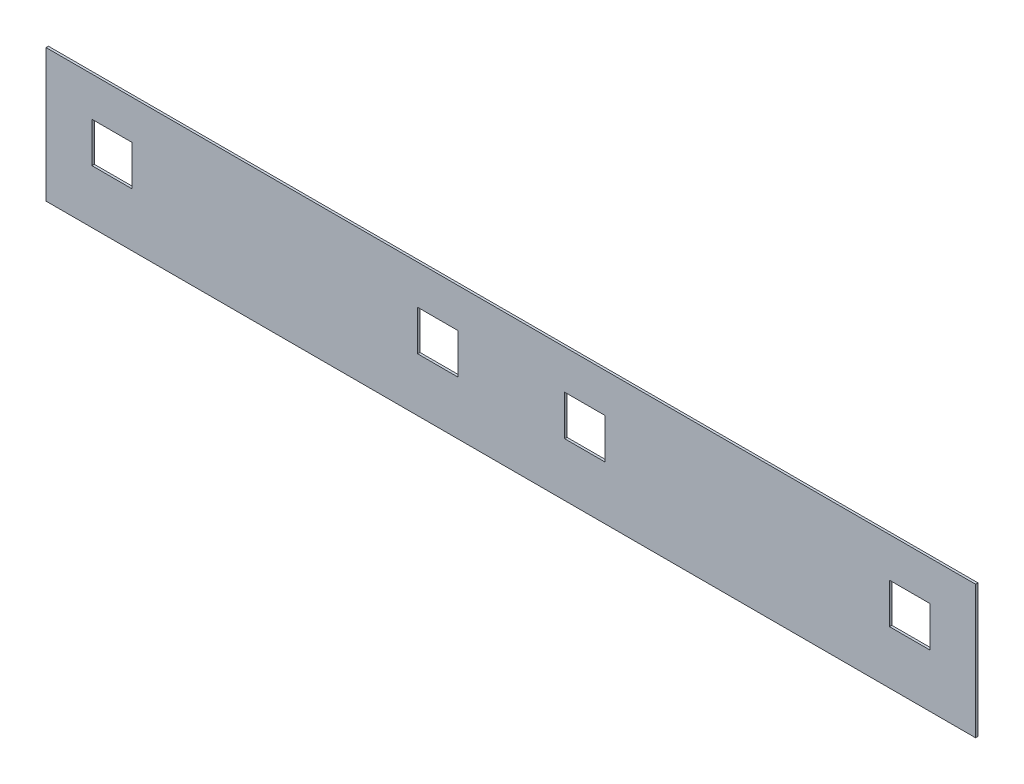
ISO-10303-21;
HEADER;
FILE_DESCRIPTION(('STEP AP214'),'2;1');
FILE_NAME('part.step','',(''),(''),'','','');
FILE_SCHEMA(('AUTOMOTIVE_DESIGN { 1 0 10303 214 1 1 1 1 }'));
ENDSEC;
DATA;
#1=APPLICATION_CONTEXT('core data for automotive mechanical design processes');
#2=APPLICATION_PROTOCOL_DEFINITION('international standard','automotive_design',2000,#1);
#3=PRODUCT_CONTEXT('',#1,'mechanical');
#4=PRODUCT('Part','Part','',(#3));
#5=PRODUCT_RELATED_PRODUCT_CATEGORY('part','',(#4));
#6=PRODUCT_DEFINITION_FORMATION('','',#4);
#7=PRODUCT_DEFINITION_CONTEXT('part definition',#1,'design');
#8=PRODUCT_DEFINITION('design','',#6,#7);
#9=PRODUCT_DEFINITION_SHAPE('','',#8);
#10=(LENGTH_UNIT() NAMED_UNIT(*) SI_UNIT(.MILLI.,.METRE.));
#11=(NAMED_UNIT(*) PLANE_ANGLE_UNIT() SI_UNIT($,.RADIAN.));
#12=(NAMED_UNIT(*) SI_UNIT($,.STERADIAN.) SOLID_ANGLE_UNIT());
#13=UNCERTAINTY_MEASURE_WITH_UNIT(LENGTH_MEASURE(1.E-05),#10,'distance_accuracy_value','');
#14=(GEOMETRIC_REPRESENTATION_CONTEXT(3) GLOBAL_UNCERTAINTY_ASSIGNED_CONTEXT((#13)) GLOBAL_UNIT_ASSIGNED_CONTEXT((#10,
#11,#12)) REPRESENTATION_CONTEXT('',''));
#15=CARTESIAN_POINT('',(0.,0.,0.));
#16=DIRECTION('',(0.,0.,1.));
#17=DIRECTION('',(1.,0.,0.));
#18=AXIS2_PLACEMENT_3D('',#15,#16,#17);
#19=CARTESIAN_POINT('',(0.,0.,-1.5875));
#20=DIRECTION('',(0.,0.,-1.));
#21=DIRECTION('',(-1.,0.,0.));
#22=AXIS2_PLACEMENT_3D('',#19,#20,#21);
#23=PLANE('',#22);
#24=DIRECTION('',(0.,-1.,0.));
#25=VECTOR('',#24,1.);
#26=CARTESIAN_POINT('',(253.08076638,0.,-1.5875));
#27=LINE('',#26,#25);
#28=CARTESIAN_POINT('',(253.08076638,18.0086,-1.5875));
#29=VERTEX_POINT('',#28);
#30=CARTESIAN_POINT('',(253.08076638,-8.88999999999995,-1.5875));
#31=VERTEX_POINT('',#30);
#32=EDGE_CURVE('E247',#29,#31,#27,.T.);
#33=ORIENTED_EDGE('',*,*,#32,.T.);
#34=DIRECTION('',(1.,0.,0.));
#35=VECTOR('',#34,1.);
#36=CARTESIAN_POINT('',(0.,-8.88999999999995,-1.5875));
#37=LINE('',#36,#35);
#38=CARTESIAN_POINT('',(280.25876638,-8.88999999999995,-1.5875));
#39=VERTEX_POINT('',#38);
#40=EDGE_CURVE('E250',#31,#39,#37,.T.);
#41=ORIENTED_EDGE('',*,*,#40,.T.);
#42=DIRECTION('',(0.,1.,0.));
#43=VECTOR('',#42,1.);
#44=CARTESIAN_POINT('',(280.25876638,0.,-1.5875));
#45=LINE('',#44,#43);
#46=CARTESIAN_POINT('',(280.25876638,18.0086000000001,-1.5875));
#47=VERTEX_POINT('',#46);
#48=EDGE_CURVE('E53',#39,#47,#45,.T.);
#49=ORIENTED_EDGE('',*,*,#48,.T.);
#50=DIRECTION('',(-1.,0.,0.));
#51=VECTOR('',#50,1.);
#52=CARTESIAN_POINT('',(0.,18.0086,-1.5875));
#53=LINE('',#52,#51);
#54=EDGE_CURVE('E255',#47,#29,#53,.T.);
#55=ORIENTED_EDGE('',*,*,#54,.T.);
#56=EDGE_LOOP('',(#33,#41,#49,#55));
#57=FACE_BOUND('',#56,.T.);
#58=DIRECTION('',(0.,-1.,0.));
#59=VECTOR('',#58,1.);
#60=CARTESIAN_POINT('',(-279.94780561,0.,-1.5875));
#61=LINE('',#60,#59);
#62=CARTESIAN_POINT('',(-279.94780561,18.288,-1.5875));
#63=VERTEX_POINT('',#62);
#64=CARTESIAN_POINT('',(-279.94780561,-8.5725,-1.5875));
#65=VERTEX_POINT('',#64);
#66=EDGE_CURVE('E219',#63,#65,#61,.T.);
#67=ORIENTED_EDGE('',*,*,#66,.T.);
#68=DIRECTION('',(1.,0.,0.));
#69=VECTOR('',#68,1.);
#70=CARTESIAN_POINT('',(0.,-8.5725,-1.5875));
#71=LINE('',#70,#69);
#72=CARTESIAN_POINT('',(-253.02380561,-8.5725,-1.5875));
#73=VERTEX_POINT('',#72);
#74=EDGE_CURVE('E222',#65,#73,#71,.T.);
#75=ORIENTED_EDGE('',*,*,#74,.T.);
#76=DIRECTION('',(0.,-1.,0.));
#77=VECTOR('',#76,1.);
#78=CARTESIAN_POINT('',(-253.02380561,0.,-1.5875));
#79=LINE('',#78,#77);
#80=CARTESIAN_POINT('',(-253.02380561,18.288,-1.5875));
#81=VERTEX_POINT('',#80);
#82=EDGE_CURVE('E226',#81,#73,#79,.T.);
#83=ORIENTED_EDGE('',*,*,#82,.F.);
#84=DIRECTION('',(1.,0.,0.));
#85=VECTOR('',#84,1.);
#86=CARTESIAN_POINT('',(0.,18.288,-1.5875));
#87=LINE('',#86,#85);
#88=EDGE_CURVE('E228',#63,#81,#87,.T.);
#89=ORIENTED_EDGE('',*,*,#88,.F.);
#90=EDGE_LOOP('',(#67,#75,#83,#89));
#91=FACE_BOUND('',#90,.T.);
#92=DIRECTION('',(1.,0.,0.));
#93=VECTOR('',#92,1.);
#94=CARTESIAN_POINT('',(0.,-8.636,-1.5875));
#95=LINE('',#94,#93);
#96=CARTESIAN_POINT('',(-62.2554000000002,-8.636,-1.5875));
#97=VERTEX_POINT('',#96);
#98=CARTESIAN_POINT('',(-35.3314000000002,-8.636,-1.5875));
#99=VERTEX_POINT('',#98);
#100=EDGE_CURVE('E179',#97,#99,#95,.T.);
#101=ORIENTED_EDGE('',*,*,#100,.T.);
#102=DIRECTION('',(0.,1.,0.));
#103=VECTOR('',#102,1.);
#104=CARTESIAN_POINT('',(-35.3314000000002,0.,-1.5875));
#105=LINE('',#104,#103);
#106=CARTESIAN_POINT('',(-35.3314000000002,18.288,-1.5875));
#107=VERTEX_POINT('',#106);
#108=EDGE_CURVE('E190',#99,#107,#105,.T.);
#109=ORIENTED_EDGE('',*,*,#108,.T.);
#110=DIRECTION('',(1.,0.,0.));
#111=VECTOR('',#110,1.);
#112=CARTESIAN_POINT('',(0.,18.288,-1.5875));
#113=LINE('',#112,#111);
#114=CARTESIAN_POINT('',(-62.2554000000002,18.288,-1.5875));
#115=VERTEX_POINT('',#114);
#116=EDGE_CURVE('E195',#115,#107,#113,.T.);
#117=ORIENTED_EDGE('',*,*,#116,.F.);
#118=DIRECTION('',(0.,-1.,0.));
#119=VECTOR('',#118,1.);
#120=CARTESIAN_POINT('',(-62.2554000000002,0.,-1.5875));
#121=LINE('',#120,#119);
#122=EDGE_CURVE('E187',#115,#97,#121,.T.);
#123=ORIENTED_EDGE('',*,*,#122,.T.);
#124=EDGE_LOOP('',(#101,#109,#117,#123));
#125=FACE_BOUND('',#124,.T.);
#126=DIRECTION('',(0.,1.,0.));
#127=VECTOR('',#126,1.);
#128=CARTESIAN_POINT('',(310.642,-44.45,-1.5875));
#129=LINE('',#128,#127);
#130=CARTESIAN_POINT('',(310.642,-44.45,-1.5875));
#131=VERTEX_POINT('',#130);
#132=CARTESIAN_POINT('',(310.642,44.45,-1.5875));
#133=VERTEX_POINT('',#132);
#134=EDGE_CURVE('E308',#131,#133,#129,.T.);
#135=ORIENTED_EDGE('',*,*,#134,.F.);
#136=DIRECTION('',(1.,0.,0.));
#137=VECTOR('',#136,1.);
#138=CARTESIAN_POINT('',(-310.642,-44.45,-1.5875));
#139=LINE('',#138,#137);
#140=CARTESIAN_POINT('',(-310.642,-44.45,-1.5875));
#141=VERTEX_POINT('',#140);
#142=EDGE_CURVE('E318',#141,#131,#139,.T.);
#143=ORIENTED_EDGE('',*,*,#142,.F.);
#144=DIRECTION('',(0.,-1.,0.));
#145=VECTOR('',#144,1.);
#146=CARTESIAN_POINT('',(-310.642,-44.45,-1.5875));
#147=LINE('',#146,#145);
#148=CARTESIAN_POINT('',(-310.642,44.45,-1.5875));
#149=VERTEX_POINT('',#148);
#150=EDGE_CURVE('E315',#149,#141,#147,.T.);
#151=ORIENTED_EDGE('',*,*,#150,.F.);
#152=DIRECTION('',(-1.,0.,0.));
#153=VECTOR('',#152,1.);
#154=CARTESIAN_POINT('',(-310.642,44.45,-1.5875));
#155=LINE('',#154,#153);
#156=EDGE_CURVE('E311',#133,#149,#155,.T.);
#157=ORIENTED_EDGE('',*,*,#156,.F.);
#158=EDGE_LOOP('',(#135,#143,#151,#157));
#159=FACE_BOUND('',#158,.T.);
#160=DIRECTION('',(1.,0.,0.));
#161=VECTOR('',#160,1.);
#162=CARTESIAN_POINT('',(0.,-8.636,-1.5875));
#163=LINE('',#162,#161);
#164=CARTESIAN_POINT('',(36.0425999999998,-8.636,-1.5875));
#165=VERTEX_POINT('',#164);
#166=CARTESIAN_POINT('',(62.9665999999998,-8.636,-1.5875));
#167=VERTEX_POINT('',#166);
#168=EDGE_CURVE('E285',#165,#167,#163,.T.);
#169=ORIENTED_EDGE('',*,*,#168,.T.);
#170=DIRECTION('',(0.,-1.,0.));
#171=VECTOR('',#170,1.);
#172=CARTESIAN_POINT('',(62.9665999999998,0.,-1.5875));
#173=LINE('',#172,#171);
#174=CARTESIAN_POINT('',(62.9665999999998,18.288,-1.5875));
#175=VERTEX_POINT('',#174);
#176=EDGE_CURVE('E276',#175,#167,#173,.T.);
#177=ORIENTED_EDGE('',*,*,#176,.F.);
#178=DIRECTION('',(-1.,0.,0.));
#179=VECTOR('',#178,1.);
#180=CARTESIAN_POINT('',(0.,18.288,-1.5875));
#181=LINE('',#180,#179);
#182=CARTESIAN_POINT('',(36.0425999999998,18.288,-1.5875));
#183=VERTEX_POINT('',#182);
#184=EDGE_CURVE('E278',#175,#183,#181,.T.);
#185=ORIENTED_EDGE('',*,*,#184,.T.);
#186=DIRECTION('',(0.,-1.,0.));
#187=VECTOR('',#186,1.);
#188=CARTESIAN_POINT('',(36.0425999999998,0.,-1.5875));
#189=LINE('',#188,#187);
#190=EDGE_CURVE('E282',#183,#165,#189,.T.);
#191=ORIENTED_EDGE('',*,*,#190,.T.);
#192=EDGE_LOOP('',(#169,#177,#185,#191));
#193=FACE_BOUND('',#192,.T.);
#194=ADVANCED_FACE('F36',(#57,#91,#125,#159,#193),#23,.T.);
#195=CARTESIAN_POINT('',(0.,0.,0.));
#196=DIRECTION('',(0.,0.,-1.));
#197=DIRECTION('',(-1.,0.,0.));
#198=AXIS2_PLACEMENT_3D('',#195,#196,#197);
#199=PLANE('',#198);
#200=DIRECTION('',(1.,0.,0.));
#201=VECTOR('',#200,1.);
#202=CARTESIAN_POINT('',(0.,-8.88999999999995,0.));
#203=LINE('',#202,#201);
#204=CARTESIAN_POINT('',(253.08076638,-8.88999999999995,0.));
#205=VERTEX_POINT('',#204);
#206=CARTESIAN_POINT('',(280.25876638,-8.88999999999995,0.));
#207=VERTEX_POINT('',#206);
#208=EDGE_CURVE('E261',#205,#207,#203,.T.);
#209=ORIENTED_EDGE('',*,*,#208,.F.);
#210=DIRECTION('',(0.,-1.,0.));
#211=VECTOR('',#210,1.);
#212=CARTESIAN_POINT('',(253.08076638,0.,0.));
#213=LINE('',#212,#211);
#214=CARTESIAN_POINT('',(253.08076638,18.0086,0.));
#215=VERTEX_POINT('',#214);
#216=EDGE_CURVE('E259',#215,#205,#213,.T.);
#217=ORIENTED_EDGE('',*,*,#216,.F.);
#218=DIRECTION('',(-1.,0.,0.));
#219=VECTOR('',#218,1.);
#220=CARTESIAN_POINT('',(0.,18.0086,0.));
#221=LINE('',#220,#219);
#222=CARTESIAN_POINT('',(280.25876638,18.0086000000001,0.));
#223=VERTEX_POINT('',#222);
#224=EDGE_CURVE('E251',#223,#215,#221,.T.);
#225=ORIENTED_EDGE('',*,*,#224,.F.);
#226=DIRECTION('',(0.,1.,0.));
#227=VECTOR('',#226,1.);
#228=CARTESIAN_POINT('',(280.25876638,0.,0.));
#229=LINE('',#228,#227);
#230=EDGE_CURVE('E264',#207,#223,#229,.T.);
#231=ORIENTED_EDGE('',*,*,#230,.F.);
#232=EDGE_LOOP('',(#209,#217,#225,#231));
#233=FACE_BOUND('',#232,.T.);
#234=DIRECTION('',(1.,0.,0.));
#235=VECTOR('',#234,1.);
#236=CARTESIAN_POINT('',(0.,-8.5725,0.));
#237=LINE('',#236,#235);
#238=CARTESIAN_POINT('',(-279.94780561,-8.5725,0.));
#239=VERTEX_POINT('',#238);
#240=CARTESIAN_POINT('',(-253.02380561,-8.5725,0.));
#241=VERTEX_POINT('',#240);
#242=EDGE_CURVE('E233',#239,#241,#237,.T.);
#243=ORIENTED_EDGE('',*,*,#242,.F.);
#244=DIRECTION('',(0.,-1.,0.));
#245=VECTOR('',#244,1.);
#246=CARTESIAN_POINT('',(-279.94780561,0.,0.));
#247=LINE('',#246,#245);
#248=CARTESIAN_POINT('',(-279.94780561,18.288,0.));
#249=VERTEX_POINT('',#248);
#250=EDGE_CURVE('E231',#249,#239,#247,.T.);
#251=ORIENTED_EDGE('',*,*,#250,.F.);
#252=DIRECTION('',(1.,0.,0.));
#253=VECTOR('',#252,1.);
#254=CARTESIAN_POINT('',(0.,18.288,0.));
#255=LINE('',#254,#253);
#256=CARTESIAN_POINT('',(-253.02380561,18.288,0.));
#257=VERTEX_POINT('',#256);
#258=EDGE_CURVE('E223',#249,#257,#255,.T.);
#259=ORIENTED_EDGE('',*,*,#258,.T.);
#260=DIRECTION('',(0.,-1.,0.));
#261=VECTOR('',#260,1.);
#262=CARTESIAN_POINT('',(-253.02380561,0.,0.));
#263=LINE('',#262,#261);
#264=EDGE_CURVE('E236',#257,#241,#263,.T.);
#265=ORIENTED_EDGE('',*,*,#264,.T.);
#266=EDGE_LOOP('',(#243,#251,#259,#265));
#267=FACE_BOUND('',#266,.T.);
#268=DIRECTION('',(0.,1.,0.));
#269=VECTOR('',#268,1.);
#270=CARTESIAN_POINT('',(-35.3314000000002,0.,0.));
#271=LINE('',#270,#269);
#272=CARTESIAN_POINT('',(-35.3314000000002,-8.636,0.));
#273=VERTEX_POINT('',#272);
#274=CARTESIAN_POINT('',(-35.3314000000002,18.288,0.));
#275=VERTEX_POINT('',#274);
#276=EDGE_CURVE('E208',#273,#275,#271,.T.);
#277=ORIENTED_EDGE('',*,*,#276,.F.);
#278=DIRECTION('',(1.,0.,0.));
#279=VECTOR('',#278,1.);
#280=CARTESIAN_POINT('',(0.,-8.636,0.));
#281=LINE('',#280,#279);
#282=CARTESIAN_POINT('',(-62.2554000000002,-8.636,0.));
#283=VERTEX_POINT('',#282);
#284=EDGE_CURVE('E182',#283,#273,#281,.T.);
#285=ORIENTED_EDGE('',*,*,#284,.F.);
#286=DIRECTION('',(0.,-1.,0.));
#287=VECTOR('',#286,1.);
#288=CARTESIAN_POINT('',(-62.2554000000002,0.,0.));
#289=LINE('',#288,#287);
#290=CARTESIAN_POINT('',(-62.2554000000002,18.288,0.));
#291=VERTEX_POINT('',#290);
#292=EDGE_CURVE('E199',#291,#283,#289,.T.);
#293=ORIENTED_EDGE('',*,*,#292,.F.);
#294=DIRECTION('',(1.,0.,0.));
#295=VECTOR('',#294,1.);
#296=CARTESIAN_POINT('',(0.,18.288,0.));
#297=LINE('',#296,#295);
#298=EDGE_CURVE('E202',#291,#275,#297,.T.);
#299=ORIENTED_EDGE('',*,*,#298,.T.);
#300=EDGE_LOOP('',(#277,#285,#293,#299));
#301=FACE_BOUND('',#300,.T.);
#302=DIRECTION('',(0.,1.,0.));
#303=VECTOR('',#302,1.);
#304=CARTESIAN_POINT('',(310.642,-44.45,0.));
#305=LINE('',#304,#303);
#306=CARTESIAN_POINT('',(310.642,-44.45,0.));
#307=VERTEX_POINT('',#306);
#308=CARTESIAN_POINT('',(310.642,44.45,0.));
#309=VERTEX_POINT('',#308);
#310=EDGE_CURVE('E301',#307,#309,#305,.T.);
#311=ORIENTED_EDGE('',*,*,#310,.T.);
#312=DIRECTION('',(-1.,0.,0.));
#313=VECTOR('',#312,1.);
#314=CARTESIAN_POINT('',(-310.642,44.45,0.));
#315=LINE('',#314,#313);
#316=CARTESIAN_POINT('',(-310.642,44.45,0.));
#317=VERTEX_POINT('',#316);
#318=EDGE_CURVE('E323',#309,#317,#315,.T.);
#319=ORIENTED_EDGE('',*,*,#318,.T.);
#320=DIRECTION('',(0.,-1.,0.));
#321=VECTOR('',#320,1.);
#322=CARTESIAN_POINT('',(-310.642,-44.45,0.));
#323=LINE('',#322,#321);
#324=CARTESIAN_POINT('',(-310.642,-44.45,0.));
#325=VERTEX_POINT('',#324);
#326=EDGE_CURVE('E326',#317,#325,#323,.T.);
#327=ORIENTED_EDGE('',*,*,#326,.T.);
#328=DIRECTION('',(1.,0.,0.));
#329=VECTOR('',#328,1.);
#330=CARTESIAN_POINT('',(-310.642,-44.45,0.));
#331=LINE('',#330,#329);
#332=EDGE_CURVE('E312',#325,#307,#331,.T.);
#333=ORIENTED_EDGE('',*,*,#332,.T.);
#334=EDGE_LOOP('',(#311,#319,#327,#333));
#335=FACE_BOUND('',#334,.T.);
#336=DIRECTION('',(0.,-1.,0.));
#337=VECTOR('',#336,1.);
#338=CARTESIAN_POINT('',(62.9665999999998,0.,0.));
#339=LINE('',#338,#337);
#340=CARTESIAN_POINT('',(62.9665999999998,18.288,0.));
#341=VERTEX_POINT('',#340);
#342=CARTESIAN_POINT('',(62.9665999999998,-8.636,0.));
#343=VERTEX_POINT('',#342);
#344=EDGE_CURVE('E215',#341,#343,#339,.T.);
#345=ORIENTED_EDGE('',*,*,#344,.T.);
#346=DIRECTION('',(1.,0.,0.));
#347=VECTOR('',#346,1.);
#348=CARTESIAN_POINT('',(0.,-8.636,0.));
#349=LINE('',#348,#347);
#350=CARTESIAN_POINT('',(36.0425999999998,-8.636,0.));
#351=VERTEX_POINT('',#350);
#352=EDGE_CURVE('E279',#351,#343,#349,.T.);
#353=ORIENTED_EDGE('',*,*,#352,.F.);
#354=DIRECTION('',(0.,-1.,0.));
#355=VECTOR('',#354,1.);
#356=CARTESIAN_POINT('',(36.0425999999998,0.,0.));
#357=LINE('',#356,#355);
#358=CARTESIAN_POINT('',(36.0425999999998,18.288,0.));
#359=VERTEX_POINT('',#358);
#360=EDGE_CURVE('E294',#359,#351,#357,.T.);
#361=ORIENTED_EDGE('',*,*,#360,.F.);
#362=DIRECTION('',(-1.,0.,0.));
#363=VECTOR('',#362,1.);
#364=CARTESIAN_POINT('',(0.,18.288,0.));
#365=LINE('',#364,#363);
#366=EDGE_CURVE('E291',#341,#359,#365,.T.);
#367=ORIENTED_EDGE('',*,*,#366,.F.);
#368=EDGE_LOOP('',(#345,#353,#361,#367));
#369=FACE_BOUND('',#368,.T.);
#370=ADVANCED_FACE('F341',(#233,#267,#301,#335,#369),#199,.F.);
#371=CARTESIAN_POINT('',(310.642,-44.45,-1.5875));
#372=DIRECTION('',(1.,0.,0.));
#373=DIRECTION('',(0.,0.,-1.));
#374=AXIS2_PLACEMENT_3D('',#371,#372,#373);
#375=PLANE('',#374);
#376=ORIENTED_EDGE('',*,*,#310,.F.);
#377=DIRECTION('',(0.,0.,1.));
#378=VECTOR('',#377,1.);
#379=CARTESIAN_POINT('',(310.642,-44.45,-1.5875));
#380=LINE('',#379,#378);
#381=EDGE_CURVE('E11',#131,#307,#380,.T.);
#382=ORIENTED_EDGE('',*,*,#381,.F.);
#383=ORIENTED_EDGE('',*,*,#134,.T.);
#384=DIRECTION('',(0.,0.,1.));
#385=VECTOR('',#384,1.);
#386=CARTESIAN_POINT('',(310.642,44.45,-1.5875));
#387=LINE('',#386,#385);
#388=EDGE_CURVE('E40',#133,#309,#387,.T.);
#389=ORIENTED_EDGE('',*,*,#388,.T.);
#390=EDGE_LOOP('',(#376,#382,#383,#389));
#391=FACE_BOUND('',#390,.T.);
#392=ADVANCED_FACE('F38',(#391),#375,.T.);
#393=CARTESIAN_POINT('',(-310.642,-44.45,-1.5875));
#394=DIRECTION('',(0.,-1.,0.));
#395=DIRECTION('',(0.,0.,-1.));
#396=AXIS2_PLACEMENT_3D('',#393,#394,#395);
#397=PLANE('',#396);
#398=ORIENTED_EDGE('',*,*,#332,.F.);
#399=DIRECTION('',(0.,0.,1.));
#400=VECTOR('',#399,1.);
#401=CARTESIAN_POINT('',(-310.642,-44.45,-1.5875));
#402=LINE('',#401,#400);
#403=EDGE_CURVE('E45',#141,#325,#402,.T.);
#404=ORIENTED_EDGE('',*,*,#403,.F.);
#405=ORIENTED_EDGE('',*,*,#142,.T.);
#406=ORIENTED_EDGE('',*,*,#381,.T.);
#407=EDGE_LOOP('',(#398,#404,#405,#406));
#408=FACE_BOUND('',#407,.T.);
#409=ADVANCED_FACE('F345',(#408),#397,.T.);
#410=CARTESIAN_POINT('',(-310.642,-44.45,-1.5875));
#411=DIRECTION('',(-1.,0.,0.));
#412=DIRECTION('',(0.,0.,1.));
#413=AXIS2_PLACEMENT_3D('',#410,#411,#412);
#414=PLANE('',#413);
#415=ORIENTED_EDGE('',*,*,#326,.F.);
#416=DIRECTION('',(0.,0.,1.));
#417=VECTOR('',#416,1.);
#418=CARTESIAN_POINT('',(-310.642,44.45,-1.5875));
#419=LINE('',#418,#417);
#420=EDGE_CURVE('E331',#149,#317,#419,.T.);
#421=ORIENTED_EDGE('',*,*,#420,.F.);
#422=ORIENTED_EDGE('',*,*,#150,.T.);
#423=ORIENTED_EDGE('',*,*,#403,.T.);
#424=EDGE_LOOP('',(#415,#421,#422,#423));
#425=FACE_BOUND('',#424,.T.);
#426=ADVANCED_FACE('F350',(#425),#414,.T.);
#427=CARTESIAN_POINT('',(-310.642,44.45,-1.5875));
#428=DIRECTION('',(0.,1.,0.));
#429=DIRECTION('',(0.,0.,1.));
#430=AXIS2_PLACEMENT_3D('',#427,#428,#429);
#431=PLANE('',#430);
#432=ORIENTED_EDGE('',*,*,#318,.F.);
#433=ORIENTED_EDGE('',*,*,#388,.F.);
#434=ORIENTED_EDGE('',*,*,#156,.T.);
#435=ORIENTED_EDGE('',*,*,#420,.T.);
#436=EDGE_LOOP('',(#432,#433,#434,#435));
#437=FACE_BOUND('',#436,.T.);
#438=ADVANCED_FACE('F339',(#437),#431,.T.);
#439=CARTESIAN_POINT('',(62.9665999999998,0.,-1.5875));
#440=DIRECTION('',(-1.,0.,0.));
#441=DIRECTION('',(0.,0.,1.));
#442=AXIS2_PLACEMENT_3D('',#439,#440,#441);
#443=PLANE('',#442);
#444=ORIENTED_EDGE('',*,*,#344,.F.);
#445=DIRECTION('',(0.,0.,1.));
#446=VECTOR('',#445,1.);
#447=CARTESIAN_POINT('',(62.9665999999998,18.288,-1.5875));
#448=LINE('',#447,#446);
#449=EDGE_CURVE('E288',#175,#341,#448,.T.);
#450=ORIENTED_EDGE('',*,*,#449,.F.);
#451=ORIENTED_EDGE('',*,*,#176,.T.);
#452=DIRECTION('',(0.,0.,1.));
#453=VECTOR('',#452,1.);
#454=CARTESIAN_POINT('',(62.9665999999998,-8.636,-1.5875));
#455=LINE('',#454,#453);
#456=EDGE_CURVE('E299',#167,#343,#455,.T.);
#457=ORIENTED_EDGE('',*,*,#456,.T.);
#458=EDGE_LOOP('',(#444,#450,#451,#457));
#459=FACE_BOUND('',#458,.T.);
#460=ADVANCED_FACE('F357',(#459),#443,.T.);
#461=CARTESIAN_POINT('',(0.,-8.636,-1.5875));
#462=DIRECTION('',(0.,-1.,0.));
#463=DIRECTION('',(0.,0.,-1.));
#464=AXIS2_PLACEMENT_3D('',#461,#462,#463);
#465=PLANE('',#464);
#466=ORIENTED_EDGE('',*,*,#352,.T.);
#467=ORIENTED_EDGE('',*,*,#456,.F.);
#468=ORIENTED_EDGE('',*,*,#168,.F.);
#469=DIRECTION('',(0.,0.,1.));
#470=VECTOR('',#469,1.);
#471=CARTESIAN_POINT('',(36.0425999999998,-8.636,-1.5875));
#472=LINE('',#471,#470);
#473=EDGE_CURVE('E302',#165,#351,#472,.T.);
#474=ORIENTED_EDGE('',*,*,#473,.T.);
#475=EDGE_LOOP('',(#466,#467,#468,#474));
#476=FACE_BOUND('',#475,.T.);
#477=ADVANCED_FACE('F371',(#476),#465,.F.);
#478=CARTESIAN_POINT('',(36.0425999999998,0.,-1.5875));
#479=DIRECTION('',(-1.,0.,0.));
#480=DIRECTION('',(0.,0.,1.));
#481=AXIS2_PLACEMENT_3D('',#478,#479,#480);
#482=PLANE('',#481);
#483=ORIENTED_EDGE('',*,*,#360,.T.);
#484=ORIENTED_EDGE('',*,*,#473,.F.);
#485=ORIENTED_EDGE('',*,*,#190,.F.);
#486=DIRECTION('',(0.,0.,1.));
#487=VECTOR('',#486,1.);
#488=CARTESIAN_POINT('',(36.0425999999998,18.288,-1.5875));
#489=LINE('',#488,#487);
#490=EDGE_CURVE('E304',#183,#359,#489,.T.);
#491=ORIENTED_EDGE('',*,*,#490,.T.);
#492=EDGE_LOOP('',(#483,#484,#485,#491));
#493=FACE_BOUND('',#492,.T.);
#494=ADVANCED_FACE('F376',(#493),#482,.F.);
#495=CARTESIAN_POINT('',(0.,18.288,-1.5875));
#496=DIRECTION('',(0.,1.,0.));
#497=DIRECTION('',(-1.,0.,0.));
#498=AXIS2_PLACEMENT_3D('',#495,#496,#497);
#499=PLANE('',#498);
#500=ORIENTED_EDGE('',*,*,#366,.T.);
#501=ORIENTED_EDGE('',*,*,#490,.F.);
#502=ORIENTED_EDGE('',*,*,#184,.F.);
#503=ORIENTED_EDGE('',*,*,#449,.T.);
#504=EDGE_LOOP('',(#500,#501,#502,#503));
#505=FACE_BOUND('',#504,.T.);
#506=ADVANCED_FACE('F373',(#505),#499,.F.);
#507=CARTESIAN_POINT('',(0.,-8.636,-1.5875));
#508=DIRECTION('',(0.,-1.,0.));
#509=DIRECTION('',(0.,0.,-1.));
#510=AXIS2_PLACEMENT_3D('',#507,#508,#509);
#511=PLANE('',#510);
#512=ORIENTED_EDGE('',*,*,#284,.T.);
#513=DIRECTION('',(0.,0.,1.));
#514=VECTOR('',#513,1.);
#515=CARTESIAN_POINT('',(-35.3314000000002,-8.636,-1.5875));
#516=LINE('',#515,#514);
#517=EDGE_CURVE('E175',#99,#273,#516,.T.);
#518=ORIENTED_EDGE('',*,*,#517,.F.);
#519=ORIENTED_EDGE('',*,*,#100,.F.);
#520=DIRECTION('',(0.,0.,1.));
#521=VECTOR('',#520,1.);
#522=CARTESIAN_POINT('',(-62.2554000000002,-8.636,-1.5875));
#523=LINE('',#522,#521);
#524=EDGE_CURVE('E213',#97,#283,#523,.T.);
#525=ORIENTED_EDGE('',*,*,#524,.T.);
#526=EDGE_LOOP('',(#512,#518,#519,#525));
#527=FACE_BOUND('',#526,.T.);
#528=ADVANCED_FACE('F177',(#527),#511,.F.);
#529=CARTESIAN_POINT('',(-62.2554000000002,0.,-1.5875));
#530=DIRECTION('',(-1.,0.,0.));
#531=DIRECTION('',(0.,-1.,0.));
#532=AXIS2_PLACEMENT_3D('',#529,#530,#531);
#533=PLANE('',#532);
#534=ORIENTED_EDGE('',*,*,#292,.T.);
#535=ORIENTED_EDGE('',*,*,#524,.F.);
#536=ORIENTED_EDGE('',*,*,#122,.F.);
#537=DIRECTION('',(0.,0.,1.));
#538=VECTOR('',#537,1.);
#539=CARTESIAN_POINT('',(-62.2554000000002,18.288,-1.5875));
#540=LINE('',#539,#538);
#541=EDGE_CURVE('E216',#115,#291,#540,.T.);
#542=ORIENTED_EDGE('',*,*,#541,.T.);
#543=EDGE_LOOP('',(#534,#535,#536,#542));
#544=FACE_BOUND('',#543,.T.);
#545=ADVANCED_FACE('F416',(#544),#533,.F.);
#546=CARTESIAN_POINT('',(0.,18.288,-1.5875));
#547=DIRECTION('',(0.,-1.,0.));
#548=DIRECTION('',(1.,0.,0.));
#549=AXIS2_PLACEMENT_3D('',#546,#547,#548);
#550=PLANE('',#549);
#551=ORIENTED_EDGE('',*,*,#298,.F.);
#552=ORIENTED_EDGE('',*,*,#541,.F.);
#553=ORIENTED_EDGE('',*,*,#116,.T.);
#554=DIRECTION('',(0.,0.,1.));
#555=VECTOR('',#554,1.);
#556=CARTESIAN_POINT('',(-35.3314000000002,18.288,-1.5875));
#557=LINE('',#556,#555);
#558=EDGE_CURVE('E186',#107,#275,#557,.T.);
#559=ORIENTED_EDGE('',*,*,#558,.T.);
#560=EDGE_LOOP('',(#551,#552,#553,#559));
#561=FACE_BOUND('',#560,.T.);
#562=ADVANCED_FACE('F419',(#561),#550,.T.);
#563=CARTESIAN_POINT('',(-35.3314000000002,0.,-1.5875));
#564=DIRECTION('',(1.,0.,0.));
#565=DIRECTION('',(0.,0.,-1.));
#566=AXIS2_PLACEMENT_3D('',#563,#564,#565);
#567=PLANE('',#566);
#568=ORIENTED_EDGE('',*,*,#276,.T.);
#569=ORIENTED_EDGE('',*,*,#558,.F.);
#570=ORIENTED_EDGE('',*,*,#108,.F.);
#571=ORIENTED_EDGE('',*,*,#517,.T.);
#572=EDGE_LOOP('',(#568,#569,#570,#571));
#573=FACE_BOUND('',#572,.T.);
#574=ADVANCED_FACE('F191',(#573),#567,.F.);
#575=CARTESIAN_POINT('',(-279.94780561,0.,-1.5875));
#576=DIRECTION('',(-1.,0.,0.));
#577=DIRECTION('',(0.,0.,1.));
#578=AXIS2_PLACEMENT_3D('',#575,#576,#577);
#579=PLANE('',#578);
#580=ORIENTED_EDGE('',*,*,#250,.T.);
#581=DIRECTION('',(0.,0.,1.));
#582=VECTOR('',#581,1.);
#583=CARTESIAN_POINT('',(-279.94780561,-8.5725,-1.5875));
#584=LINE('',#583,#582);
#585=EDGE_CURVE('E230',#65,#239,#584,.T.);
#586=ORIENTED_EDGE('',*,*,#585,.F.);
#587=ORIENTED_EDGE('',*,*,#66,.F.);
#588=DIRECTION('',(0.,0.,1.));
#589=VECTOR('',#588,1.);
#590=CARTESIAN_POINT('',(-279.94780561,18.288,-1.5875));
#591=LINE('',#590,#589);
#592=EDGE_CURVE('E209',#63,#249,#591,.T.);
#593=ORIENTED_EDGE('',*,*,#592,.T.);
#594=EDGE_LOOP('',(#580,#586,#587,#593));
#595=FACE_BOUND('',#594,.T.);
#596=ADVANCED_FACE('F400',(#595),#579,.F.);
#597=CARTESIAN_POINT('',(0.,18.288,-1.5875));
#598=DIRECTION('',(0.,-1.,0.));
#599=DIRECTION('',(0.,0.,-1.));
#600=AXIS2_PLACEMENT_3D('',#597,#598,#599);
#601=PLANE('',#600);
#602=ORIENTED_EDGE('',*,*,#258,.F.);
#603=ORIENTED_EDGE('',*,*,#592,.F.);
#604=ORIENTED_EDGE('',*,*,#88,.T.);
#605=DIRECTION('',(0.,0.,1.));
#606=VECTOR('',#605,1.);
#607=CARTESIAN_POINT('',(-253.02380561,18.288,-1.5875));
#608=LINE('',#607,#606);
#609=EDGE_CURVE('E242',#81,#257,#608,.T.);
#610=ORIENTED_EDGE('',*,*,#609,.T.);
#611=EDGE_LOOP('',(#602,#603,#604,#610));
#612=FACE_BOUND('',#611,.T.);
#613=ADVANCED_FACE('F403',(#612),#601,.T.);
#614=CARTESIAN_POINT('',(-253.02380561,0.,-1.5875));
#615=DIRECTION('',(-1.,0.,0.));
#616=DIRECTION('',(0.,0.,1.));
#617=AXIS2_PLACEMENT_3D('',#614,#615,#616);
#618=PLANE('',#617);
#619=ORIENTED_EDGE('',*,*,#264,.F.);
#620=ORIENTED_EDGE('',*,*,#609,.F.);
#621=ORIENTED_EDGE('',*,*,#82,.T.);
#622=DIRECTION('',(0.,0.,1.));
#623=VECTOR('',#622,1.);
#624=CARTESIAN_POINT('',(-253.02380561,-8.5725,-1.5875));
#625=LINE('',#624,#623);
#626=EDGE_CURVE('E61',#73,#241,#625,.T.);
#627=ORIENTED_EDGE('',*,*,#626,.T.);
#628=EDGE_LOOP('',(#619,#620,#621,#627));
#629=FACE_BOUND('',#628,.T.);
#630=ADVANCED_FACE('F407',(#629),#618,.T.);
#631=CARTESIAN_POINT('',(0.,-8.5725,-1.5875));
#632=DIRECTION('',(0.,-1.,0.));
#633=DIRECTION('',(0.,0.,-1.));
#634=AXIS2_PLACEMENT_3D('',#631,#632,#633);
#635=PLANE('',#634);
#636=ORIENTED_EDGE('',*,*,#242,.T.);
#637=ORIENTED_EDGE('',*,*,#626,.F.);
#638=ORIENTED_EDGE('',*,*,#74,.F.);
#639=ORIENTED_EDGE('',*,*,#585,.T.);
#640=EDGE_LOOP('',(#636,#637,#638,#639));
#641=FACE_BOUND('',#640,.T.);
#642=ADVANCED_FACE('F388',(#641),#635,.F.);
#643=CARTESIAN_POINT('',(253.08076638,0.,-1.5875));
#644=DIRECTION('',(-1.,0.,0.));
#645=DIRECTION('',(0.,0.,1.));
#646=AXIS2_PLACEMENT_3D('',#643,#644,#645);
#647=PLANE('',#646);
#648=ORIENTED_EDGE('',*,*,#216,.T.);
#649=DIRECTION('',(0.,0.,1.));
#650=VECTOR('',#649,1.);
#651=CARTESIAN_POINT('',(253.08076638,-8.88999999999995,-1.5875));
#652=LINE('',#651,#650);
#653=EDGE_CURVE('E258',#31,#205,#652,.T.);
#654=ORIENTED_EDGE('',*,*,#653,.F.);
#655=ORIENTED_EDGE('',*,*,#32,.F.);
#656=DIRECTION('',(0.,0.,1.));
#657=VECTOR('',#656,1.);
#658=CARTESIAN_POINT('',(253.08076638,18.0086,-1.5875));
#659=LINE('',#658,#657);
#660=EDGE_CURVE('E234',#29,#215,#659,.T.);
#661=ORIENTED_EDGE('',*,*,#660,.T.);
#662=EDGE_LOOP('',(#648,#654,#655,#661));
#663=FACE_BOUND('',#662,.T.);
#664=ADVANCED_FACE('F384',(#663),#647,.F.);
#665=CARTESIAN_POINT('',(0.,18.0086,-1.5875));
#666=DIRECTION('',(0.,1.,0.));
#667=DIRECTION('',(-1.,0.,0.));
#668=AXIS2_PLACEMENT_3D('',#665,#666,#667);
#669=PLANE('',#668);
#670=ORIENTED_EDGE('',*,*,#224,.T.);
#671=ORIENTED_EDGE('',*,*,#660,.F.);
#672=ORIENTED_EDGE('',*,*,#54,.F.);
#673=DIRECTION('',(0.,0.,1.));
#674=VECTOR('',#673,1.);
#675=CARTESIAN_POINT('',(280.25876638,18.0086000000001,-1.5875));
#676=LINE('',#675,#674);
#677=EDGE_CURVE('E270',#47,#223,#676,.T.);
#678=ORIENTED_EDGE('',*,*,#677,.T.);
#679=EDGE_LOOP('',(#670,#671,#672,#678));
#680=FACE_BOUND('',#679,.T.);
#681=ADVANCED_FACE('F387',(#680),#669,.F.);
#682=CARTESIAN_POINT('',(280.25876638,0.,-1.5875));
#683=DIRECTION('',(1.,0.,0.));
#684=DIRECTION('',(0.,0.,-1.));
#685=AXIS2_PLACEMENT_3D('',#682,#683,#684);
#686=PLANE('',#685);
#687=ORIENTED_EDGE('',*,*,#230,.T.);
#688=ORIENTED_EDGE('',*,*,#677,.F.);
#689=ORIENTED_EDGE('',*,*,#48,.F.);
#690=DIRECTION('',(0.,0.,1.));
#691=VECTOR('',#690,1.);
#692=CARTESIAN_POINT('',(280.25876638,-8.88999999999995,-1.5875));
#693=LINE('',#692,#691);
#694=EDGE_CURVE('E272',#39,#207,#693,.T.);
#695=ORIENTED_EDGE('',*,*,#694,.T.);
#696=EDGE_LOOP('',(#687,#688,#689,#695));
#697=FACE_BOUND('',#696,.T.);
#698=ADVANCED_FACE('F393',(#697),#686,.F.);
#699=CARTESIAN_POINT('',(0.,-8.88999999999995,-1.5875));
#700=DIRECTION('',(0.,-1.,0.));
#701=DIRECTION('',(0.,0.,-1.));
#702=AXIS2_PLACEMENT_3D('',#699,#700,#701);
#703=PLANE('',#702);
#704=ORIENTED_EDGE('',*,*,#208,.T.);
#705=ORIENTED_EDGE('',*,*,#694,.F.);
#706=ORIENTED_EDGE('',*,*,#40,.F.);
#707=ORIENTED_EDGE('',*,*,#653,.T.);
#708=EDGE_LOOP('',(#704,#705,#706,#707));
#709=FACE_BOUND('',#708,.T.);
#710=ADVANCED_FACE('F390',(#709),#703,.F.);
#711=CLOSED_SHELL('',(#194,#370,#392,#409,#426,#438,#460,#477,#494,#506,#528,#545,#562,#574,
#596,#613,#630,#642,#664,#681,#698,#710));
#712=MANIFOLD_SOLID_BREP('B2',#711);
#713=ADVANCED_BREP_SHAPE_REPRESENTATION('',(#18,#712),#14);
#714=SHAPE_DEFINITION_REPRESENTATION(#9,#713);
ENDSEC;
END-ISO-10303-21;
